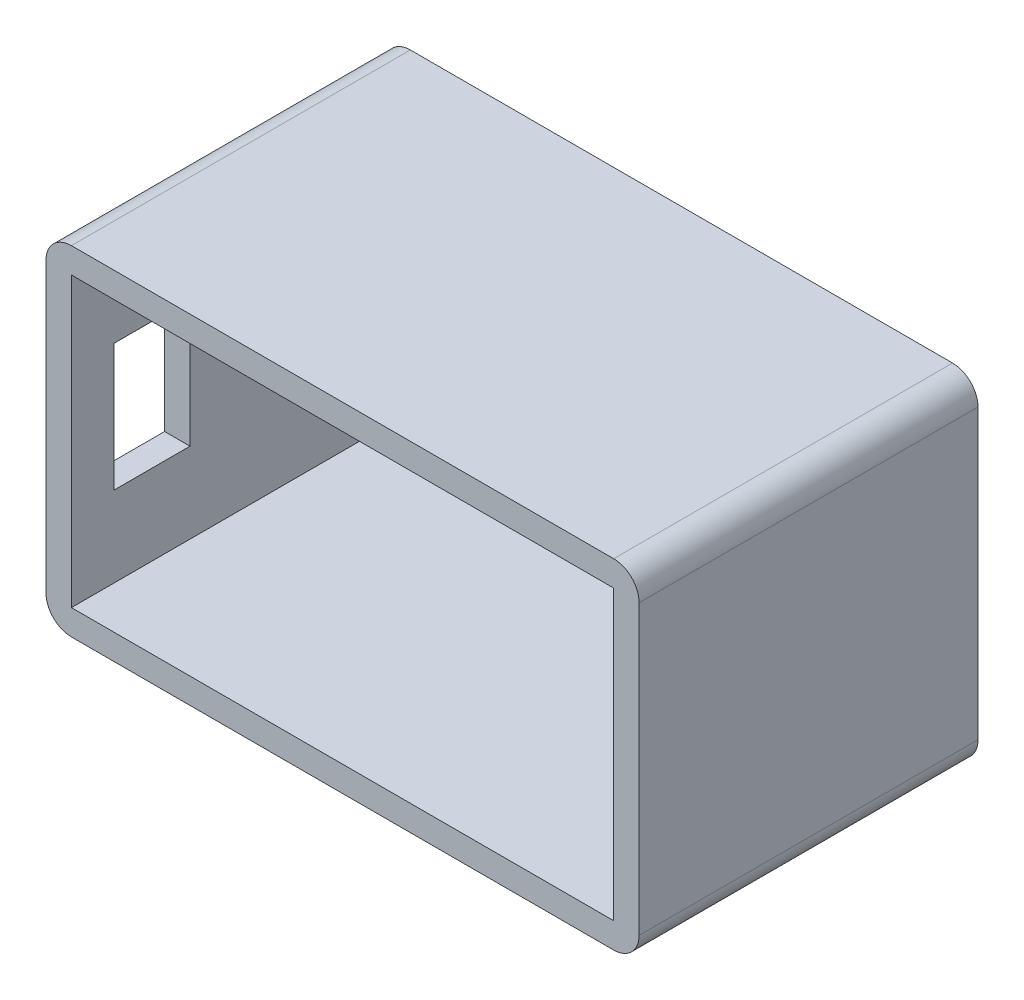
ISO-10303-21;
HEADER;
FILE_DESCRIPTION(('STEP AP214'),'2;1');
FILE_NAME('part.step','',(''),(''),'','','');
FILE_SCHEMA(('AUTOMOTIVE_DESIGN { 1 0 10303 214 1 1 1 1 }'));
ENDSEC;
DATA;
#1=APPLICATION_CONTEXT('core data for automotive mechanical design processes');
#2=APPLICATION_PROTOCOL_DEFINITION('international standard','automotive_design',2000,#1);
#3=PRODUCT_CONTEXT('',#1,'mechanical');
#4=PRODUCT('Part','Part','',(#3));
#5=PRODUCT_RELATED_PRODUCT_CATEGORY('part','',(#4));
#6=PRODUCT_DEFINITION_FORMATION('','',#4);
#7=PRODUCT_DEFINITION_CONTEXT('part definition',#1,'design');
#8=PRODUCT_DEFINITION('design','',#6,#7);
#9=PRODUCT_DEFINITION_SHAPE('','',#8);
#10=(LENGTH_UNIT() NAMED_UNIT(*) SI_UNIT(.MILLI.,.METRE.));
#11=(NAMED_UNIT(*) PLANE_ANGLE_UNIT() SI_UNIT($,.RADIAN.));
#12=(NAMED_UNIT(*) SI_UNIT($,.STERADIAN.) SOLID_ANGLE_UNIT());
#13=UNCERTAINTY_MEASURE_WITH_UNIT(LENGTH_MEASURE(1.E-05),#10,'distance_accuracy_value','');
#14=(GEOMETRIC_REPRESENTATION_CONTEXT(3) GLOBAL_UNCERTAINTY_ASSIGNED_CONTEXT((#13)) GLOBAL_UNIT_ASSIGNED_CONTEXT((#10,
#11,#12)) REPRESENTATION_CONTEXT('',''));
#15=CARTESIAN_POINT('',(0.,0.,0.));
#16=DIRECTION('',(0.,0.,1.));
#17=DIRECTION('',(1.,0.,0.));
#18=AXIS2_PLACEMENT_3D('',#15,#16,#17);
#19=CARTESIAN_POINT('',(0.,0.,40.));
#20=DIRECTION('',(0.,0.,-1.));
#21=DIRECTION('',(-1.,0.,0.));
#22=AXIS2_PLACEMENT_3D('',#19,#20,#21);
#23=PLANE('',#22);
#24=DIRECTION('',(1.,0.,0.));
#25=VECTOR('',#24,1.);
#26=CARTESIAN_POINT('',(-35.,-20.,40.));
#27=LINE('',#26,#25);
#28=CARTESIAN_POINT('',(-32.,-20.,40.));
#29=VERTEX_POINT('',#28);
#30=CARTESIAN_POINT('',(32.,-20.,40.));
#31=VERTEX_POINT('',#30);
#32=EDGE_CURVE('E260',#29,#31,#27,.T.);
#33=ORIENTED_EDGE('',*,*,#32,.T.);
#34=CARTESIAN_POINT('',(32.,-17.,40.));
#35=DIRECTION('',(0.,0.,-1.));
#36=DIRECTION('',(-1.,0.,0.));
#37=AXIS2_PLACEMENT_3D('',#34,#35,#36);
#38=CIRCLE('',#37,3.);
#39=CARTESIAN_POINT('',(35.,-17.,40.));
#40=VERTEX_POINT('',#39);
#41=EDGE_CURVE('E325',#31,#40,#38,.F.);
#42=ORIENTED_EDGE('',*,*,#41,.T.);
#43=DIRECTION('',(0.,1.,0.));
#44=VECTOR('',#43,1.);
#45=CARTESIAN_POINT('',(35.,-20.,40.));
#46=LINE('',#45,#44);
#47=CARTESIAN_POINT('',(35.,17.,40.));
#48=VERTEX_POINT('',#47);
#49=EDGE_CURVE('E249',#40,#48,#46,.T.);
#50=ORIENTED_EDGE('',*,*,#49,.T.);
#51=CARTESIAN_POINT('',(32.,17.,40.));
#52=DIRECTION('',(0.,0.,-1.));
#53=DIRECTION('',(-1.,0.,0.));
#54=AXIS2_PLACEMENT_3D('',#51,#52,#53);
#55=CIRCLE('',#54,3.);
#56=CARTESIAN_POINT('',(32.,20.,40.));
#57=VERTEX_POINT('',#56);
#58=EDGE_CURVE('E322',#48,#57,#55,.F.);
#59=ORIENTED_EDGE('',*,*,#58,.T.);
#60=DIRECTION('',(-1.,0.,0.));
#61=VECTOR('',#60,1.);
#62=CARTESIAN_POINT('',(-35.,20.,40.));
#63=LINE('',#62,#61);
#64=CARTESIAN_POINT('',(-32.,20.,40.));
#65=VERTEX_POINT('',#64);
#66=EDGE_CURVE('E253',#57,#65,#63,.T.);
#67=ORIENTED_EDGE('',*,*,#66,.T.);
#68=CARTESIAN_POINT('',(-32.,17.,40.));
#69=DIRECTION('',(0.,0.,-1.));
#70=DIRECTION('',(-1.,0.,0.));
#71=AXIS2_PLACEMENT_3D('',#68,#69,#70);
#72=CIRCLE('',#71,3.);
#73=CARTESIAN_POINT('',(-35.,17.,40.));
#74=VERTEX_POINT('',#73);
#75=EDGE_CURVE('E67',#65,#74,#72,.F.);
#76=ORIENTED_EDGE('',*,*,#75,.T.);
#77=DIRECTION('',(0.,-1.,0.));
#78=VECTOR('',#77,1.);
#79=CARTESIAN_POINT('',(-35.,-20.,40.));
#80=LINE('',#79,#78);
#81=CARTESIAN_POINT('',(-35.,-17.,40.));
#82=VERTEX_POINT('',#81);
#83=EDGE_CURVE('E257',#74,#82,#80,.T.);
#84=ORIENTED_EDGE('',*,*,#83,.T.);
#85=CARTESIAN_POINT('',(-32.,-17.,40.));
#86=DIRECTION('',(0.,0.,-1.));
#87=DIRECTION('',(-1.,0.,0.));
#88=AXIS2_PLACEMENT_3D('',#85,#86,#87);
#89=CIRCLE('',#88,3.);
#90=EDGE_CURVE('E317',#82,#29,#89,.F.);
#91=ORIENTED_EDGE('',*,*,#90,.T.);
#92=EDGE_LOOP('',(#33,#42,#50,#59,#67,#76,#84,#91));
#93=FACE_BOUND('',#92,.T.);
#94=DIRECTION('',(0.,1.,0.));
#95=VECTOR('',#94,1.);
#96=CARTESIAN_POINT('',(32.,0.,40.));
#97=LINE('',#96,#95);
#98=CARTESIAN_POINT('',(32.,-17.,40.));
#99=VERTEX_POINT('',#98);
#100=CARTESIAN_POINT('',(32.,17.,40.));
#101=VERTEX_POINT('',#100);
#102=EDGE_CURVE('E237',#99,#101,#97,.T.);
#103=ORIENTED_EDGE('',*,*,#102,.F.);
#104=DIRECTION('',(1.,0.,0.));
#105=VECTOR('',#104,1.);
#106=CARTESIAN_POINT('',(0.,-17.,40.));
#107=LINE('',#106,#105);
#108=CARTESIAN_POINT('',(-32.,-17.,40.));
#109=VERTEX_POINT('',#108);
#110=EDGE_CURVE('E222',#109,#99,#107,.T.);
#111=ORIENTED_EDGE('',*,*,#110,.F.);
#112=DIRECTION('',(0.,-1.,0.));
#113=VECTOR('',#112,1.);
#114=CARTESIAN_POINT('',(-32.,0.,40.));
#115=LINE('',#114,#113);
#116=CARTESIAN_POINT('',(-32.,17.,40.));
#117=VERTEX_POINT('',#116);
#118=EDGE_CURVE('E243',#117,#109,#115,.T.);
#119=ORIENTED_EDGE('',*,*,#118,.F.);
#120=DIRECTION('',(-1.,0.,0.));
#121=VECTOR('',#120,1.);
#122=CARTESIAN_POINT('',(0.,17.,40.));
#123=LINE('',#122,#121);
#124=EDGE_CURVE('E240',#101,#117,#123,.T.);
#125=ORIENTED_EDGE('',*,*,#124,.F.);
#126=EDGE_LOOP('',(#103,#111,#119,#125));
#127=FACE_BOUND('',#126,.T.);
#128=ADVANCED_FACE('F45',(#93,#127),#23,.F.);
#129=CARTESIAN_POINT('',(35.,-20.,40.));
#130=DIRECTION('',(-1.,0.,0.));
#131=DIRECTION('',(0.,0.,1.));
#132=AXIS2_PLACEMENT_3D('',#129,#130,#131);
#133=PLANE('',#132);
#134=ORIENTED_EDGE('',*,*,#49,.F.);
#135=DIRECTION('',(0.,0.,-1.));
#136=VECTOR('',#135,1.);
#137=CARTESIAN_POINT('',(35.,-17.,40.));
#138=LINE('',#137,#136);
#139=CARTESIAN_POINT('',(35.,-17.,0.));
#140=VERTEX_POINT('',#139);
#141=EDGE_CURVE('E294',#40,#140,#138,.T.);
#142=ORIENTED_EDGE('',*,*,#141,.T.);
#143=DIRECTION('',(0.,1.,0.));
#144=VECTOR('',#143,1.);
#145=CARTESIAN_POINT('',(35.,-20.,0.));
#146=LINE('',#145,#144);
#147=CARTESIAN_POINT('',(35.,17.,0.));
#148=VERTEX_POINT('',#147);
#149=EDGE_CURVE('E215',#140,#148,#146,.T.);
#150=ORIENTED_EDGE('',*,*,#149,.T.);
#151=DIRECTION('',(0.,0.,-1.));
#152=VECTOR('',#151,1.);
#153=CARTESIAN_POINT('',(35.,17.,40.));
#154=LINE('',#153,#152);
#155=EDGE_CURVE('E291',#148,#48,#154,.F.);
#156=ORIENTED_EDGE('',*,*,#155,.T.);
#157=EDGE_LOOP('',(#134,#142,#150,#156));
#158=FACE_BOUND('',#157,.T.);
#159=ADVANCED_FACE('F365',(#158),#133,.F.);
#160=CARTESIAN_POINT('',(-35.,20.,40.));
#161=DIRECTION('',(0.,-1.,0.));
#162=DIRECTION('',(0.,0.,-1.));
#163=AXIS2_PLACEMENT_3D('',#160,#161,#162);
#164=PLANE('',#163);
#165=ORIENTED_EDGE('',*,*,#66,.F.);
#166=DIRECTION('',(0.,0.,-1.));
#167=VECTOR('',#166,1.);
#168=CARTESIAN_POINT('',(32.,20.,40.));
#169=LINE('',#168,#167);
#170=CARTESIAN_POINT('',(32.,20.,0.));
#171=VERTEX_POINT('',#170);
#172=EDGE_CURVE('E331',#57,#171,#169,.T.);
#173=ORIENTED_EDGE('',*,*,#172,.T.);
#174=DIRECTION('',(-1.,0.,0.));
#175=VECTOR('',#174,1.);
#176=CARTESIAN_POINT('',(-35.,20.,0.));
#177=LINE('',#176,#175);
#178=CARTESIAN_POINT('',(-32.,20.,0.));
#179=VERTEX_POINT('',#178);
#180=EDGE_CURVE('E268',#171,#179,#177,.T.);
#181=ORIENTED_EDGE('',*,*,#180,.T.);
#182=DIRECTION('',(0.,0.,-1.));
#183=VECTOR('',#182,1.);
#184=CARTESIAN_POINT('',(-32.,20.,40.));
#185=LINE('',#184,#183);
#186=EDGE_CURVE('E328',#179,#65,#185,.F.);
#187=ORIENTED_EDGE('',*,*,#186,.T.);
#188=EDGE_LOOP('',(#165,#173,#181,#187));
#189=FACE_BOUND('',#188,.T.);
#190=ADVANCED_FACE('F339',(#189),#164,.F.);
#191=CARTESIAN_POINT('',(-35.,-20.,40.));
#192=DIRECTION('',(1.,0.,0.));
#193=DIRECTION('',(0.,0.,-1.));
#194=AXIS2_PLACEMENT_3D('',#191,#192,#193);
#195=PLANE('',#194);
#196=DIRECTION('',(0.,0.,1.));
#197=VECTOR('',#196,1.);
#198=CARTESIAN_POINT('',(-35.,-7.5,35.));
#199=LINE('',#198,#197);
#200=CARTESIAN_POINT('',(-35.,-7.5,26.));
#201=VERTEX_POINT('',#200);
#202=CARTESIAN_POINT('',(-35.,-7.5,35.));
#203=VERTEX_POINT('',#202);
#204=EDGE_CURVE('E177',#201,#203,#199,.T.);
#205=ORIENTED_EDGE('',*,*,#204,.F.);
#206=DIRECTION('',(0.,-1.,0.));
#207=VECTOR('',#206,1.);
#208=CARTESIAN_POINT('',(-35.,-7.5,26.));
#209=LINE('',#208,#207);
#210=CARTESIAN_POINT('',(-35.,7.5,26.));
#211=VERTEX_POINT('',#210);
#212=EDGE_CURVE('E183',#211,#201,#209,.T.);
#213=ORIENTED_EDGE('',*,*,#212,.F.);
#214=DIRECTION('',(0.,0.,-1.));
#215=VECTOR('',#214,1.);
#216=CARTESIAN_POINT('',(-35.,7.5,35.));
#217=LINE('',#216,#215);
#218=CARTESIAN_POINT('',(-35.,7.5,35.));
#219=VERTEX_POINT('',#218);
#220=EDGE_CURVE('E187',#219,#211,#217,.T.);
#221=ORIENTED_EDGE('',*,*,#220,.F.);
#222=DIRECTION('',(0.,1.,0.));
#223=VECTOR('',#222,1.);
#224=CARTESIAN_POINT('',(-35.,-7.5,35.));
#225=LINE('',#224,#223);
#226=EDGE_CURVE('E165',#203,#219,#225,.T.);
#227=ORIENTED_EDGE('',*,*,#226,.F.);
#228=EDGE_LOOP('',(#205,#213,#221,#227));
#229=FACE_BOUND('',#228,.T.);
#230=ORIENTED_EDGE('',*,*,#83,.F.);
#231=DIRECTION('',(0.,0.,-1.));
#232=VECTOR('',#231,1.);
#233=CARTESIAN_POINT('',(-35.,17.,40.));
#234=LINE('',#233,#232);
#235=CARTESIAN_POINT('',(-35.,17.,0.));
#236=VERTEX_POINT('',#235);
#237=EDGE_CURVE('E11',#74,#236,#234,.T.);
#238=ORIENTED_EDGE('',*,*,#237,.T.);
#239=DIRECTION('',(0.,-1.,0.));
#240=VECTOR('',#239,1.);
#241=CARTESIAN_POINT('',(-35.,-20.,0.));
#242=LINE('',#241,#240);
#243=CARTESIAN_POINT('',(-35.,-17.,0.));
#244=VERTEX_POINT('',#243);
#245=EDGE_CURVE('E272',#236,#244,#242,.T.);
#246=ORIENTED_EDGE('',*,*,#245,.T.);
#247=DIRECTION('',(0.,0.,-1.));
#248=VECTOR('',#247,1.);
#249=CARTESIAN_POINT('',(-35.,-17.,40.));
#250=LINE('',#249,#248);
#251=EDGE_CURVE('E54',#244,#82,#250,.F.);
#252=ORIENTED_EDGE('',*,*,#251,.T.);
#253=EDGE_LOOP('',(#230,#238,#246,#252));
#254=FACE_BOUND('',#253,.T.);
#255=ADVANCED_FACE('F185',(#229,#254),#195,.F.);
#256=CARTESIAN_POINT('',(-35.,-20.,40.));
#257=DIRECTION('',(0.,1.,0.));
#258=DIRECTION('',(0.,0.,1.));
#259=AXIS2_PLACEMENT_3D('',#256,#257,#258);
#260=PLANE('',#259);
#261=DIRECTION('',(1.,0.,0.));
#262=VECTOR('',#261,1.);
#263=CARTESIAN_POINT('',(-35.,-20.,0.));
#264=LINE('',#263,#262);
#265=CARTESIAN_POINT('',(-32.,-20.,0.));
#266=VERTEX_POINT('',#265);
#267=CARTESIAN_POINT('',(32.,-20.,0.));
#268=VERTEX_POINT('',#267);
#269=EDGE_CURVE('E254',#266,#268,#264,.T.);
#270=ORIENTED_EDGE('',*,*,#269,.T.);
#271=DIRECTION('',(0.,0.,-1.));
#272=VECTOR('',#271,1.);
#273=CARTESIAN_POINT('',(32.,-20.,40.));
#274=LINE('',#273,#272);
#275=EDGE_CURVE('E314',#268,#31,#274,.F.);
#276=ORIENTED_EDGE('',*,*,#275,.T.);
#277=ORIENTED_EDGE('',*,*,#32,.F.);
#278=DIRECTION('',(0.,0.,-1.));
#279=VECTOR('',#278,1.);
#280=CARTESIAN_POINT('',(-32.,-20.,40.));
#281=LINE('',#280,#279);
#282=EDGE_CURVE('E310',#29,#266,#281,.T.);
#283=ORIENTED_EDGE('',*,*,#282,.T.);
#284=EDGE_LOOP('',(#270,#276,#277,#283));
#285=FACE_BOUND('',#284,.T.);
#286=ADVANCED_FACE('F357',(#285),#260,.F.);
#287=CARTESIAN_POINT('',(0.,0.,0.));
#288=DIRECTION('',(0.,0.,-1.));
#289=DIRECTION('',(-1.,0.,0.));
#290=AXIS2_PLACEMENT_3D('',#287,#288,#289);
#291=PLANE('',#290);
#292=CARTESIAN_POINT('',(0.,0.,0.));
#293=DIRECTION('',(0.,0.,-1.));
#294=DIRECTION('',(-1.,0.,0.));
#295=AXIS2_PLACEMENT_3D('',#292,#293,#294);
#296=CIRCLE('',#295,3.5);
#297=CARTESIAN_POINT('',(-3.5,0.,0.));
#298=VERTEX_POINT('',#297);
#299=EDGE_CURVE('E197',#298,#298,#296,.T.);
#300=ORIENTED_EDGE('',*,*,#299,.F.);
#301=EDGE_LOOP('',(#300));
#302=FACE_BOUND('',#301,.T.);
#303=ORIENTED_EDGE('',*,*,#149,.F.);
#304=CARTESIAN_POINT('',(32.,-17.,0.));
#305=DIRECTION('',(0.,0.,-1.));
#306=DIRECTION('',(-1.,0.,0.));
#307=AXIS2_PLACEMENT_3D('',#304,#305,#306);
#308=CIRCLE('',#307,3.);
#309=EDGE_CURVE('E307',#140,#268,#308,.T.);
#310=ORIENTED_EDGE('',*,*,#309,.T.);
#311=ORIENTED_EDGE('',*,*,#269,.F.);
#312=CARTESIAN_POINT('',(-32.,-17.,0.));
#313=DIRECTION('',(0.,0.,-1.));
#314=DIRECTION('',(-1.,0.,0.));
#315=AXIS2_PLACEMENT_3D('',#312,#313,#314);
#316=CIRCLE('',#315,3.);
#317=EDGE_CURVE('E298',#266,#244,#316,.T.);
#318=ORIENTED_EDGE('',*,*,#317,.T.);
#319=ORIENTED_EDGE('',*,*,#245,.F.);
#320=CARTESIAN_POINT('',(-32.,17.,0.));
#321=DIRECTION('',(0.,0.,-1.));
#322=DIRECTION('',(-1.,0.,0.));
#323=AXIS2_PLACEMENT_3D('',#320,#321,#322);
#324=CIRCLE('',#323,3.);
#325=EDGE_CURVE('E301',#236,#179,#324,.T.);
#326=ORIENTED_EDGE('',*,*,#325,.T.);
#327=ORIENTED_EDGE('',*,*,#180,.F.);
#328=CARTESIAN_POINT('',(32.,17.,0.));
#329=DIRECTION('',(0.,0.,-1.));
#330=DIRECTION('',(-1.,0.,0.));
#331=AXIS2_PLACEMENT_3D('',#328,#329,#330);
#332=CIRCLE('',#331,3.);
#333=EDGE_CURVE('E304',#171,#148,#332,.T.);
#334=ORIENTED_EDGE('',*,*,#333,.T.);
#335=EDGE_LOOP('',(#303,#310,#311,#318,#319,#326,#327,#334));
#336=FACE_BOUND('',#335,.T.);
#337=ADVANCED_FACE('F345',(#302,#336),#291,.T.);
#338=CARTESIAN_POINT('',(32.,-20.,40.));
#339=DIRECTION('',(-1.,0.,0.));
#340=DIRECTION('',(0.,0.,1.));
#341=AXIS2_PLACEMENT_3D('',#338,#339,#340);
#342=PLANE('',#341);
#343=DIRECTION('',(0.,1.,0.));
#344=VECTOR('',#343,1.);
#345=CARTESIAN_POINT('',(32.,0.,3.));
#346=LINE('',#345,#344);
#347=CARTESIAN_POINT('',(32.,-17.,3.));
#348=VERTEX_POINT('',#347);
#349=CARTESIAN_POINT('',(32.,17.,3.));
#350=VERTEX_POINT('',#349);
#351=EDGE_CURVE('E206',#348,#350,#346,.T.);
#352=ORIENTED_EDGE('',*,*,#351,.F.);
#353=DIRECTION('',(0.,0.,-1.));
#354=VECTOR('',#353,1.);
#355=CARTESIAN_POINT('',(32.,-17.,40.));
#356=LINE('',#355,#354);
#357=EDGE_CURVE('E217',#99,#348,#356,.T.);
#358=ORIENTED_EDGE('',*,*,#357,.F.);
#359=ORIENTED_EDGE('',*,*,#102,.T.);
#360=DIRECTION('',(0.,0.,-1.));
#361=VECTOR('',#360,1.);
#362=CARTESIAN_POINT('',(32.,17.,40.));
#363=LINE('',#362,#361);
#364=EDGE_CURVE('E211',#101,#350,#363,.T.);
#365=ORIENTED_EDGE('',*,*,#364,.T.);
#366=EDGE_LOOP('',(#352,#358,#359,#365));
#367=FACE_BOUND('',#366,.T.);
#368=ADVANCED_FACE('F388',(#367),#342,.T.);
#369=CARTESIAN_POINT('',(-35.,17.,40.));
#370=DIRECTION('',(0.,-1.,0.));
#371=DIRECTION('',(0.,0.,-1.));
#372=AXIS2_PLACEMENT_3D('',#369,#370,#371);
#373=PLANE('',#372);
#374=DIRECTION('',(-1.,0.,0.));
#375=VECTOR('',#374,1.);
#376=CARTESIAN_POINT('',(0.,17.,3.));
#377=LINE('',#376,#375);
#378=CARTESIAN_POINT('',(-32.,17.,3.));
#379=VERTEX_POINT('',#378);
#380=EDGE_CURVE('E210',#350,#379,#377,.T.);
#381=ORIENTED_EDGE('',*,*,#380,.F.);
#382=ORIENTED_EDGE('',*,*,#364,.F.);
#383=ORIENTED_EDGE('',*,*,#124,.T.);
#384=DIRECTION('',(0.,0.,-1.));
#385=VECTOR('',#384,1.);
#386=CARTESIAN_POINT('',(-32.,17.,40.));
#387=LINE('',#386,#385);
#388=EDGE_CURVE('E216',#117,#379,#387,.T.);
#389=ORIENTED_EDGE('',*,*,#388,.T.);
#390=EDGE_LOOP('',(#381,#382,#383,#389));
#391=FACE_BOUND('',#390,.T.);
#392=ADVANCED_FACE('F511',(#391),#373,.T.);
#393=CARTESIAN_POINT('',(-32.,-20.,40.));
#394=DIRECTION('',(1.,0.,0.));
#395=DIRECTION('',(0.,0.,-1.));
#396=AXIS2_PLACEMENT_3D('',#393,#394,#395);
#397=PLANE('',#396);
#398=DIRECTION('',(0.,1.,0.));
#399=VECTOR('',#398,1.);
#400=CARTESIAN_POINT('',(-32.,-20.,26.));
#401=LINE('',#400,#399);
#402=CARTESIAN_POINT('',(-32.,-7.5,26.));
#403=VERTEX_POINT('',#402);
#404=CARTESIAN_POINT('',(-32.,7.5,26.));
#405=VERTEX_POINT('',#404);
#406=EDGE_CURVE('E288',#403,#405,#401,.T.);
#407=ORIENTED_EDGE('',*,*,#406,.F.);
#408=DIRECTION('',(0.,0.,-1.));
#409=VECTOR('',#408,1.);
#410=CARTESIAN_POINT('',(-32.,-7.5,40.));
#411=LINE('',#410,#409);
#412=CARTESIAN_POINT('',(-32.,-7.5,35.));
#413=VERTEX_POINT('',#412);
#414=EDGE_CURVE('E264',#413,#403,#411,.T.);
#415=ORIENTED_EDGE('',*,*,#414,.F.);
#416=DIRECTION('',(0.,-1.,0.));
#417=VECTOR('',#416,1.);
#418=CARTESIAN_POINT('',(-32.,-20.,35.));
#419=LINE('',#418,#417);
#420=CARTESIAN_POINT('',(-32.,7.5,35.));
#421=VERTEX_POINT('',#420);
#422=EDGE_CURVE('E168',#421,#413,#419,.T.);
#423=ORIENTED_EDGE('',*,*,#422,.F.);
#424=DIRECTION('',(0.,0.,1.));
#425=VECTOR('',#424,1.);
#426=CARTESIAN_POINT('',(-32.,7.5,40.));
#427=LINE('',#426,#425);
#428=EDGE_CURVE('E285',#405,#421,#427,.T.);
#429=ORIENTED_EDGE('',*,*,#428,.F.);
#430=EDGE_LOOP('',(#407,#415,#423,#429));
#431=FACE_BOUND('',#430,.T.);
#432=DIRECTION('',(0.,-1.,0.));
#433=VECTOR('',#432,1.);
#434=CARTESIAN_POINT('',(-32.,0.,3.));
#435=LINE('',#434,#433);
#436=CARTESIAN_POINT('',(-32.,-17.,3.));
#437=VERTEX_POINT('',#436);
#438=EDGE_CURVE('E225',#379,#437,#435,.T.);
#439=ORIENTED_EDGE('',*,*,#438,.F.);
#440=ORIENTED_EDGE('',*,*,#388,.F.);
#441=ORIENTED_EDGE('',*,*,#118,.T.);
#442=DIRECTION('',(0.,0.,-1.));
#443=VECTOR('',#442,1.);
#444=CARTESIAN_POINT('',(-32.,-17.,40.));
#445=LINE('',#444,#443);
#446=EDGE_CURVE('E221',#109,#437,#445,.T.);
#447=ORIENTED_EDGE('',*,*,#446,.T.);
#448=EDGE_LOOP('',(#439,#440,#441,#447));
#449=FACE_BOUND('',#448,.T.);
#450=ADVANCED_FACE('F502',(#431,#449),#397,.T.);
#451=CARTESIAN_POINT('',(-35.,-17.,40.));
#452=DIRECTION('',(0.,1.,0.));
#453=DIRECTION('',(0.,0.,1.));
#454=AXIS2_PLACEMENT_3D('',#451,#452,#453);
#455=PLANE('',#454);
#456=DIRECTION('',(1.,0.,0.));
#457=VECTOR('',#456,1.);
#458=CARTESIAN_POINT('',(0.,-17.,3.));
#459=LINE('',#458,#457);
#460=EDGE_CURVE('E231',#437,#348,#459,.T.);
#461=ORIENTED_EDGE('',*,*,#460,.F.);
#462=ORIENTED_EDGE('',*,*,#446,.F.);
#463=ORIENTED_EDGE('',*,*,#110,.T.);
#464=ORIENTED_EDGE('',*,*,#357,.T.);
#465=EDGE_LOOP('',(#461,#462,#463,#464));
#466=FACE_BOUND('',#465,.T.);
#467=ADVANCED_FACE('F493',(#466),#455,.T.);
#468=CARTESIAN_POINT('',(0.,0.,3.));
#469=DIRECTION('',(0.,0.,-1.));
#470=DIRECTION('',(-1.,0.,0.));
#471=AXIS2_PLACEMENT_3D('',#468,#469,#470);
#472=PLANE('',#471);
#473=CARTESIAN_POINT('',(0.,0.,3.));
#474=DIRECTION('',(0.,0.,-1.));
#475=DIRECTION('',(-1.,0.,0.));
#476=AXIS2_PLACEMENT_3D('',#473,#474,#475);
#477=CIRCLE('',#476,3.5);
#478=CARTESIAN_POINT('',(-3.5,0.,3.));
#479=VERTEX_POINT('',#478);
#480=EDGE_CURVE('E205',#479,#479,#477,.T.);
#481=ORIENTED_EDGE('',*,*,#480,.T.);
#482=EDGE_LOOP('',(#481));
#483=FACE_BOUND('',#482,.T.);
#484=ORIENTED_EDGE('',*,*,#351,.T.);
#485=ORIENTED_EDGE('',*,*,#380,.T.);
#486=ORIENTED_EDGE('',*,*,#438,.T.);
#487=ORIENTED_EDGE('',*,*,#460,.T.);
#488=EDGE_LOOP('',(#484,#485,#486,#487));
#489=FACE_BOUND('',#488,.T.);
#490=ADVANCED_FACE('F384',(#483,#489),#472,.F.);
#491=CARTESIAN_POINT('',(0.,0.,40.));
#492=DIRECTION('',(0.,0.,-1.));
#493=DIRECTION('',(-1.,0.,0.));
#494=AXIS2_PLACEMENT_3D('',#491,#492,#493);
#495=CYLINDRICAL_SURFACE('',#494,3.5);
#496=ORIENTED_EDGE('',*,*,#299,.T.);
#497=EDGE_LOOP('',(#496));
#498=FACE_BOUND('',#497,.T.);
#499=ORIENTED_EDGE('',*,*,#480,.F.);
#500=EDGE_LOOP('',(#499));
#501=FACE_BOUND('',#500,.T.);
#502=ADVANCED_FACE('F473',(#498,#501),#495,.F.);
#503=CARTESIAN_POINT('',(5.,-7.5,26.));
#504=DIRECTION('',(0.,0.,-1.));
#505=DIRECTION('',(-1.,0.,0.));
#506=AXIS2_PLACEMENT_3D('',#503,#504,#505);
#507=PLANE('',#506);
#508=ORIENTED_EDGE('',*,*,#406,.T.);
#509=DIRECTION('',(-1.,0.,0.));
#510=VECTOR('',#509,1.);
#511=CARTESIAN_POINT('',(5.,7.5,26.));
#512=LINE('',#511,#510);
#513=EDGE_CURVE('E194',#405,#211,#512,.T.);
#514=ORIENTED_EDGE('',*,*,#513,.T.);
#515=ORIENTED_EDGE('',*,*,#212,.T.);
#516=DIRECTION('',(-1.,0.,0.));
#517=VECTOR('',#516,1.);
#518=CARTESIAN_POINT('',(5.,-7.5,26.));
#519=LINE('',#518,#517);
#520=EDGE_CURVE('E173',#403,#201,#519,.T.);
#521=ORIENTED_EDGE('',*,*,#520,.F.);
#522=EDGE_LOOP('',(#508,#514,#515,#521));
#523=FACE_BOUND('',#522,.T.);
#524=ADVANCED_FACE('F463',(#523),#507,.F.);
#525=CARTESIAN_POINT('',(5.,7.5,35.));
#526=DIRECTION('',(0.,1.,0.));
#527=DIRECTION('',(0.,0.,1.));
#528=AXIS2_PLACEMENT_3D('',#525,#526,#527);
#529=PLANE('',#528);
#530=ORIENTED_EDGE('',*,*,#428,.T.);
#531=DIRECTION('',(-1.,0.,0.));
#532=VECTOR('',#531,1.);
#533=CARTESIAN_POINT('',(5.,7.5,35.));
#534=LINE('',#533,#532);
#535=EDGE_CURVE('E172',#421,#219,#534,.T.);
#536=ORIENTED_EDGE('',*,*,#535,.T.);
#537=ORIENTED_EDGE('',*,*,#220,.T.);
#538=ORIENTED_EDGE('',*,*,#513,.F.);
#539=EDGE_LOOP('',(#530,#536,#537,#538));
#540=FACE_BOUND('',#539,.T.);
#541=ADVANCED_FACE('F454',(#540),#529,.F.);
#542=CARTESIAN_POINT('',(5.,-7.5,35.));
#543=DIRECTION('',(0.,0.,1.));
#544=DIRECTION('',(1.,0.,0.));
#545=AXIS2_PLACEMENT_3D('',#542,#543,#544);
#546=PLANE('',#545);
#547=ORIENTED_EDGE('',*,*,#422,.T.);
#548=DIRECTION('',(-1.,0.,0.));
#549=VECTOR('',#548,1.);
#550=CARTESIAN_POINT('',(5.,-7.5,35.));
#551=LINE('',#550,#549);
#552=EDGE_CURVE('E160',#413,#203,#551,.T.);
#553=ORIENTED_EDGE('',*,*,#552,.T.);
#554=ORIENTED_EDGE('',*,*,#226,.T.);
#555=ORIENTED_EDGE('',*,*,#535,.F.);
#556=EDGE_LOOP('',(#547,#553,#554,#555));
#557=FACE_BOUND('',#556,.T.);
#558=ADVANCED_FACE('F162',(#557),#546,.F.);
#559=CARTESIAN_POINT('',(5.,-7.5,35.));
#560=DIRECTION('',(0.,-1.,0.));
#561=DIRECTION('',(0.,0.,-1.));
#562=AXIS2_PLACEMENT_3D('',#559,#560,#561);
#563=PLANE('',#562);
#564=ORIENTED_EDGE('',*,*,#414,.T.);
#565=ORIENTED_EDGE('',*,*,#520,.T.);
#566=ORIENTED_EDGE('',*,*,#204,.T.);
#567=ORIENTED_EDGE('',*,*,#552,.F.);
#568=EDGE_LOOP('',(#564,#565,#566,#567));
#569=FACE_BOUND('',#568,.T.);
#570=ADVANCED_FACE('F178',(#569),#563,.F.);
#571=CARTESIAN_POINT('',(32.,-17.,40.));
#572=DIRECTION('',(0.,0.,-1.));
#573=DIRECTION('',(-1.,0.,0.));
#574=AXIS2_PLACEMENT_3D('',#571,#572,#573);
#575=CYLINDRICAL_SURFACE('',#574,3.);
#576=ORIENTED_EDGE('',*,*,#41,.F.);
#577=ORIENTED_EDGE('',*,*,#275,.F.);
#578=ORIENTED_EDGE('',*,*,#309,.F.);
#579=ORIENTED_EDGE('',*,*,#141,.F.);
#580=EDGE_LOOP('',(#576,#577,#578,#579));
#581=FACE_BOUND('',#580,.T.);
#582=ADVANCED_FACE('F362',(#581),#575,.T.);
#583=CARTESIAN_POINT('',(32.,17.,40.));
#584=DIRECTION('',(0.,0.,-1.));
#585=DIRECTION('',(-1.,0.,0.));
#586=AXIS2_PLACEMENT_3D('',#583,#584,#585);
#587=CYLINDRICAL_SURFACE('',#586,3.);
#588=ORIENTED_EDGE('',*,*,#58,.F.);
#589=ORIENTED_EDGE('',*,*,#155,.F.);
#590=ORIENTED_EDGE('',*,*,#333,.F.);
#591=ORIENTED_EDGE('',*,*,#172,.F.);
#592=EDGE_LOOP('',(#588,#589,#590,#591));
#593=FACE_BOUND('',#592,.T.);
#594=ADVANCED_FACE('F367',(#593),#587,.T.);
#595=CARTESIAN_POINT('',(-32.,17.,40.));
#596=DIRECTION('',(0.,0.,-1.));
#597=DIRECTION('',(-1.,0.,0.));
#598=AXIS2_PLACEMENT_3D('',#595,#596,#597);
#599=CYLINDRICAL_SURFACE('',#598,3.);
#600=ORIENTED_EDGE('',*,*,#75,.F.);
#601=ORIENTED_EDGE('',*,*,#186,.F.);
#602=ORIENTED_EDGE('',*,*,#325,.F.);
#603=ORIENTED_EDGE('',*,*,#237,.F.);
#604=EDGE_LOOP('',(#600,#601,#602,#603));
#605=FACE_BOUND('',#604,.T.);
#606=ADVANCED_FACE('F349',(#605),#599,.T.);
#607=CARTESIAN_POINT('',(-32.,-17.,40.));
#608=DIRECTION('',(0.,0.,-1.));
#609=DIRECTION('',(-1.,0.,0.));
#610=AXIS2_PLACEMENT_3D('',#607,#608,#609);
#611=CYLINDRICAL_SURFACE('',#610,3.);
#612=ORIENTED_EDGE('',*,*,#90,.F.);
#613=ORIENTED_EDGE('',*,*,#251,.F.);
#614=ORIENTED_EDGE('',*,*,#317,.F.);
#615=ORIENTED_EDGE('',*,*,#282,.F.);
#616=EDGE_LOOP('',(#612,#613,#614,#615));
#617=FACE_BOUND('',#616,.T.);
#618=ADVANCED_FACE('F47',(#617),#611,.T.);
#619=CLOSED_SHELL('',(#128,#159,#190,#255,#286,#337,#368,#392,#450,#467,#490,#502,#524,#541,
#558,#570,#582,#594,#606,#618));
#620=MANIFOLD_SOLID_BREP('B2',#619);
#621=ADVANCED_BREP_SHAPE_REPRESENTATION('',(#18,#620),#14);
#622=SHAPE_DEFINITION_REPRESENTATION(#9,#621);
ENDSEC;
END-ISO-10303-21;
